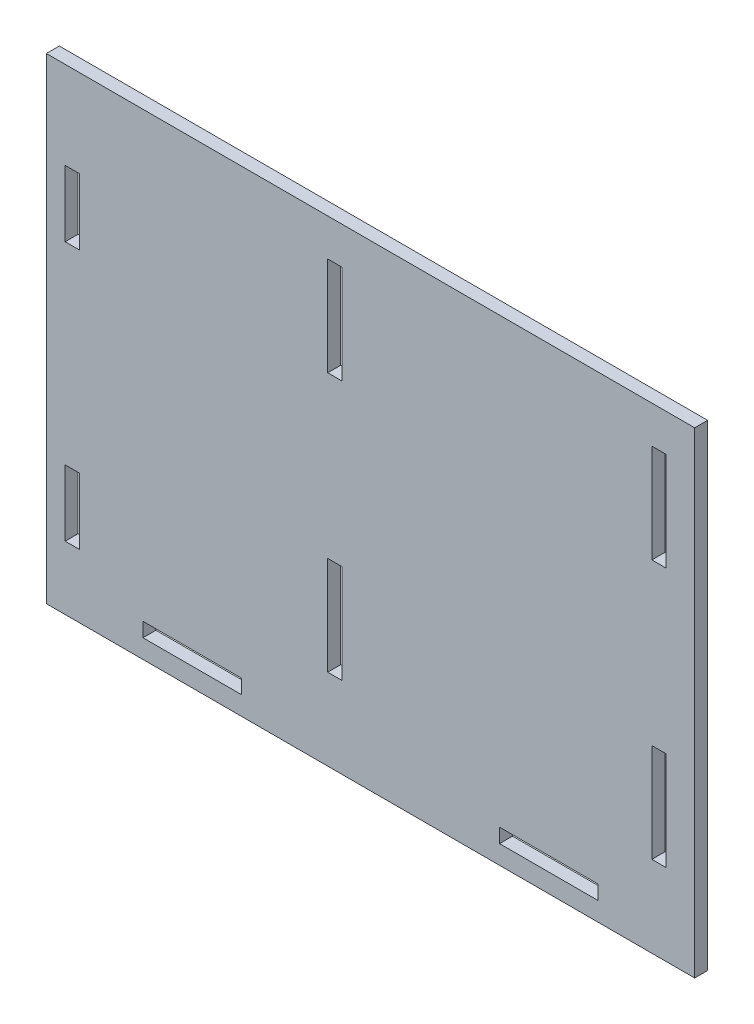
ISO-10303-21;
HEADER;
FILE_DESCRIPTION(('STEP AP214'),'2;1');
FILE_NAME('part.step','',(''),(''),'','','');
FILE_SCHEMA(('AUTOMOTIVE_DESIGN { 1 0 10303 214 1 1 1 1 }'));
ENDSEC;
DATA;
#1=APPLICATION_CONTEXT('core data for automotive mechanical design processes');
#2=APPLICATION_PROTOCOL_DEFINITION('international standard','automotive_design',2000,#1);
#3=PRODUCT_CONTEXT('',#1,'mechanical');
#4=PRODUCT('Part','Part','',(#3));
#5=PRODUCT_RELATED_PRODUCT_CATEGORY('part','',(#4));
#6=PRODUCT_DEFINITION_FORMATION('','',#4);
#7=PRODUCT_DEFINITION_CONTEXT('part definition',#1,'design');
#8=PRODUCT_DEFINITION('design','',#6,#7);
#9=PRODUCT_DEFINITION_SHAPE('','',#8);
#10=(LENGTH_UNIT() NAMED_UNIT(*) SI_UNIT(.MILLI.,.METRE.));
#11=(NAMED_UNIT(*) PLANE_ANGLE_UNIT() SI_UNIT($,.RADIAN.));
#12=(NAMED_UNIT(*) SI_UNIT($,.STERADIAN.) SOLID_ANGLE_UNIT());
#13=UNCERTAINTY_MEASURE_WITH_UNIT(LENGTH_MEASURE(1.E-05),#10,'distance_accuracy_value','');
#14=(GEOMETRIC_REPRESENTATION_CONTEXT(3) GLOBAL_UNCERTAINTY_ASSIGNED_CONTEXT((#13)) GLOBAL_UNIT_ASSIGNED_CONTEXT((#10,
#11,#12)) REPRESENTATION_CONTEXT('',''));
#15=CARTESIAN_POINT('',(0.,0.,0.));
#16=DIRECTION('',(0.,0.,1.));
#17=DIRECTION('',(1.,0.,0.));
#18=AXIS2_PLACEMENT_3D('',#15,#16,#17);
#19=CARTESIAN_POINT('',(0.,0.,4.));
#20=DIRECTION('',(0.,0.,1.));
#21=DIRECTION('',(1.,0.,0.));
#22=AXIS2_PLACEMENT_3D('',#19,#20,#21);
#23=PLANE('',#22);
#24=DIRECTION('',(1.,0.,0.));
#25=VECTOR('',#24,1.);
#26=CARTESIAN_POINT('',(0.,0.,4.));
#27=LINE('',#26,#25);
#28=CARTESIAN_POINT('',(0.,0.,4.));
#29=VERTEX_POINT('',#28);
#30=CARTESIAN_POINT('',(200.,0.,4.));
#31=VERTEX_POINT('',#30);
#32=EDGE_CURVE('E521',#29,#31,#27,.T.);
#33=ORIENTED_EDGE('',*,*,#32,.T.);
#34=DIRECTION('',(0.,1.,0.));
#35=VECTOR('',#34,1.);
#36=CARTESIAN_POINT('',(200.,0.,4.));
#37=LINE('',#36,#35);
#38=CARTESIAN_POINT('',(200.,147.,4.));
#39=VERTEX_POINT('',#38);
#40=EDGE_CURVE('E524',#31,#39,#37,.T.);
#41=ORIENTED_EDGE('',*,*,#40,.T.);
#42=DIRECTION('',(-1.,0.,0.));
#43=VECTOR('',#42,1.);
#44=CARTESIAN_POINT('',(200.,147.,4.));
#45=LINE('',#44,#43);
#46=CARTESIAN_POINT('',(0.,147.,4.));
#47=VERTEX_POINT('',#46);
#48=EDGE_CURVE('E527',#39,#47,#45,.T.);
#49=ORIENTED_EDGE('',*,*,#48,.T.);
#50=DIRECTION('',(0.,-1.,0.));
#51=VECTOR('',#50,1.);
#52=CARTESIAN_POINT('',(0.,0.,4.));
#53=LINE('',#52,#51);
#54=EDGE_CURVE('E529',#47,#29,#53,.T.);
#55=ORIENTED_EDGE('',*,*,#54,.T.);
#56=EDGE_LOOP('',(#33,#41,#49,#55));
#57=FACE_BOUND('',#56,.T.);
#58=DIRECTION('',(1.,0.,0.));
#59=VECTOR('',#58,1.);
#60=CARTESIAN_POINT('',(186.8,25.1,4.));
#61=LINE('',#60,#59);
#62=CARTESIAN_POINT('',(186.8,25.1,4.));
#63=VERTEX_POINT('',#62);
#64=CARTESIAN_POINT('',(191.2,25.1,4.));
#65=VERTEX_POINT('',#64);
#66=EDGE_CURVE('E492',#63,#65,#61,.T.);
#67=ORIENTED_EDGE('',*,*,#66,.F.);
#68=DIRECTION('',(0.,-1.,0.));
#69=VECTOR('',#68,1.);
#70=CARTESIAN_POINT('',(186.8,25.1,4.));
#71=LINE('',#70,#69);
#72=CARTESIAN_POINT('',(186.8,55.5,4.));
#73=VERTEX_POINT('',#72);
#74=EDGE_CURVE('E490',#73,#63,#71,.T.);
#75=ORIENTED_EDGE('',*,*,#74,.F.);
#76=DIRECTION('',(-1.,0.,0.));
#77=VECTOR('',#76,1.);
#78=CARTESIAN_POINT('',(186.8,55.5,4.));
#79=LINE('',#78,#77);
#80=CARTESIAN_POINT('',(191.2,55.5,4.));
#81=VERTEX_POINT('',#80);
#82=EDGE_CURVE('E498',#81,#73,#79,.T.);
#83=ORIENTED_EDGE('',*,*,#82,.F.);
#84=DIRECTION('',(0.,1.,0.));
#85=VECTOR('',#84,1.);
#86=CARTESIAN_POINT('',(191.2,25.1,4.));
#87=LINE('',#86,#85);
#88=EDGE_CURVE('E495',#65,#81,#87,.T.);
#89=ORIENTED_EDGE('',*,*,#88,.F.);
#90=EDGE_LOOP('',(#67,#75,#83,#89));
#91=FACE_BOUND('',#90,.T.);
#92=DIRECTION('',(1.,0.,0.));
#93=VECTOR('',#92,1.);
#94=CARTESIAN_POINT('',(139.8,5.8,4.));
#95=LINE('',#94,#93);
#96=CARTESIAN_POINT('',(139.8,5.8,4.));
#97=VERTEX_POINT('',#96);
#98=CARTESIAN_POINT('',(170.2,5.8,4.));
#99=VERTEX_POINT('',#98);
#100=EDGE_CURVE('E461',#97,#99,#95,.T.);
#101=ORIENTED_EDGE('',*,*,#100,.F.);
#102=DIRECTION('',(0.,-1.,0.));
#103=VECTOR('',#102,1.);
#104=CARTESIAN_POINT('',(139.8,10.2,4.));
#105=LINE('',#104,#103);
#106=CARTESIAN_POINT('',(139.8,10.2,4.));
#107=VERTEX_POINT('',#106);
#108=EDGE_CURVE('E459',#107,#97,#105,.T.);
#109=ORIENTED_EDGE('',*,*,#108,.F.);
#110=DIRECTION('',(-1.,0.,0.));
#111=VECTOR('',#110,1.);
#112=CARTESIAN_POINT('',(139.8,10.2,4.));
#113=LINE('',#112,#111);
#114=CARTESIAN_POINT('',(170.2,10.2,4.));
#115=VERTEX_POINT('',#114);
#116=EDGE_CURVE('E467',#115,#107,#113,.T.);
#117=ORIENTED_EDGE('',*,*,#116,.F.);
#118=DIRECTION('',(0.,1.,0.));
#119=VECTOR('',#118,1.);
#120=CARTESIAN_POINT('',(170.2,10.2,4.));
#121=LINE('',#120,#119);
#122=EDGE_CURVE('E464',#99,#115,#121,.T.);
#123=ORIENTED_EDGE('',*,*,#122,.F.);
#124=EDGE_LOOP('',(#101,#109,#117,#123));
#125=FACE_BOUND('',#124,.T.);
#126=DIRECTION('',(-1.,0.,0.));
#127=VECTOR('',#126,1.);
#128=CARTESIAN_POINT('',(10.2,40.,4.));
#129=LINE('',#128,#127);
#130=CARTESIAN_POINT('',(10.2,40.,4.));
#131=VERTEX_POINT('',#130);
#132=CARTESIAN_POINT('',(5.8,40.,4.));
#133=VERTEX_POINT('',#132);
#134=EDGE_CURVE('E430',#131,#133,#129,.T.);
#135=ORIENTED_EDGE('',*,*,#134,.F.);
#136=DIRECTION('',(0.,1.,0.));
#137=VECTOR('',#136,1.);
#138=CARTESIAN_POINT('',(10.2,40.,4.));
#139=LINE('',#138,#137);
#140=CARTESIAN_POINT('',(10.2,19.6,4.));
#141=VERTEX_POINT('',#140);
#142=EDGE_CURVE('E428',#141,#131,#139,.T.);
#143=ORIENTED_EDGE('',*,*,#142,.F.);
#144=DIRECTION('',(1.,0.,0.));
#145=VECTOR('',#144,1.);
#146=CARTESIAN_POINT('',(10.2,19.6,4.));
#147=LINE('',#146,#145);
#148=CARTESIAN_POINT('',(5.8,19.6,4.));
#149=VERTEX_POINT('',#148);
#150=EDGE_CURVE('E436',#149,#141,#147,.T.);
#151=ORIENTED_EDGE('',*,*,#150,.F.);
#152=DIRECTION('',(0.,-1.,0.));
#153=VECTOR('',#152,1.);
#154=CARTESIAN_POINT('',(5.8,40.,4.));
#155=LINE('',#154,#153);
#156=EDGE_CURVE('E433',#133,#149,#155,.T.);
#157=ORIENTED_EDGE('',*,*,#156,.F.);
#158=EDGE_LOOP('',(#135,#143,#151,#157));
#159=FACE_BOUND('',#158,.T.);
#160=DIRECTION('',(-1.,0.,0.));
#161=VECTOR('',#160,1.);
#162=CARTESIAN_POINT('',(60.2,10.2,4.));
#163=LINE('',#162,#161);
#164=CARTESIAN_POINT('',(60.2,10.2,4.));
#165=VERTEX_POINT('',#164);
#166=CARTESIAN_POINT('',(29.8,10.2,4.));
#167=VERTEX_POINT('',#166);
#168=EDGE_CURVE('E399',#165,#167,#163,.T.);
#169=ORIENTED_EDGE('',*,*,#168,.F.);
#170=DIRECTION('',(0.,1.,0.));
#171=VECTOR('',#170,1.);
#172=CARTESIAN_POINT('',(60.2,10.2,4.));
#173=LINE('',#172,#171);
#174=CARTESIAN_POINT('',(60.2,5.8,4.));
#175=VERTEX_POINT('',#174);
#176=EDGE_CURVE('E397',#175,#165,#173,.T.);
#177=ORIENTED_EDGE('',*,*,#176,.F.);
#178=DIRECTION('',(1.,0.,0.));
#179=VECTOR('',#178,1.);
#180=CARTESIAN_POINT('',(60.2,5.8,4.));
#181=LINE('',#180,#179);
#182=CARTESIAN_POINT('',(29.8,5.8,4.));
#183=VERTEX_POINT('',#182);
#184=EDGE_CURVE('E405',#183,#175,#181,.T.);
#185=ORIENTED_EDGE('',*,*,#184,.F.);
#186=DIRECTION('',(0.,-1.,0.));
#187=VECTOR('',#186,1.);
#188=CARTESIAN_POINT('',(29.8,10.2,4.));
#189=LINE('',#188,#187);
#190=EDGE_CURVE('E402',#167,#183,#189,.T.);
#191=ORIENTED_EDGE('',*,*,#190,.F.);
#192=EDGE_LOOP('',(#169,#177,#185,#191));
#193=FACE_BOUND('',#192,.T.);
#194=DIRECTION('',(1.,0.,0.));
#195=VECTOR('',#194,1.);
#196=CARTESIAN_POINT('',(5.8,99.6,4.));
#197=LINE('',#196,#195);
#198=CARTESIAN_POINT('',(5.8,99.6,4.));
#199=VERTEX_POINT('',#198);
#200=CARTESIAN_POINT('',(10.2,99.6,4.));
#201=VERTEX_POINT('',#200);
#202=EDGE_CURVE('E368',#199,#201,#197,.T.);
#203=ORIENTED_EDGE('',*,*,#202,.F.);
#204=DIRECTION('',(0.,-1.,0.));
#205=VECTOR('',#204,1.);
#206=CARTESIAN_POINT('',(5.8,99.6,4.));
#207=LINE('',#206,#205);
#208=CARTESIAN_POINT('',(5.8,120.,4.));
#209=VERTEX_POINT('',#208);
#210=EDGE_CURVE('E366',#209,#199,#207,.T.);
#211=ORIENTED_EDGE('',*,*,#210,.F.);
#212=DIRECTION('',(-1.,0.,0.));
#213=VECTOR('',#212,1.);
#214=CARTESIAN_POINT('',(5.8,120.,4.));
#215=LINE('',#214,#213);
#216=CARTESIAN_POINT('',(10.2,120.,4.));
#217=VERTEX_POINT('',#216);
#218=EDGE_CURVE('E374',#217,#209,#215,.T.);
#219=ORIENTED_EDGE('',*,*,#218,.F.);
#220=DIRECTION('',(0.,1.,0.));
#221=VECTOR('',#220,1.);
#222=CARTESIAN_POINT('',(10.2,99.6,4.));
#223=LINE('',#222,#221);
#224=EDGE_CURVE('E371',#201,#217,#223,.T.);
#225=ORIENTED_EDGE('',*,*,#224,.F.);
#226=EDGE_LOOP('',(#203,#211,#219,#225));
#227=FACE_BOUND('',#226,.T.);
#228=DIRECTION('',(1.,0.,0.));
#229=VECTOR('',#228,1.);
#230=CARTESIAN_POINT('',(186.8,105.1,4.));
#231=LINE('',#230,#229);
#232=CARTESIAN_POINT('',(186.8,105.1,4.));
#233=VERTEX_POINT('',#232);
#234=CARTESIAN_POINT('',(191.2,105.1,4.));
#235=VERTEX_POINT('',#234);
#236=EDGE_CURVE('E337',#233,#235,#231,.T.);
#237=ORIENTED_EDGE('',*,*,#236,.F.);
#238=DIRECTION('',(0.,-1.,0.));
#239=VECTOR('',#238,1.);
#240=CARTESIAN_POINT('',(186.8,135.5,4.));
#241=LINE('',#240,#239);
#242=CARTESIAN_POINT('',(186.8,135.5,4.));
#243=VERTEX_POINT('',#242);
#244=EDGE_CURVE('E335',#243,#233,#241,.T.);
#245=ORIENTED_EDGE('',*,*,#244,.F.);
#246=DIRECTION('',(-1.,0.,0.));
#247=VECTOR('',#246,1.);
#248=CARTESIAN_POINT('',(186.8,135.5,4.));
#249=LINE('',#248,#247);
#250=CARTESIAN_POINT('',(191.2,135.5,4.));
#251=VERTEX_POINT('',#250);
#252=EDGE_CURVE('E343',#251,#243,#249,.T.);
#253=ORIENTED_EDGE('',*,*,#252,.F.);
#254=DIRECTION('',(0.,1.,0.));
#255=VECTOR('',#254,1.);
#256=CARTESIAN_POINT('',(191.2,135.5,4.));
#257=LINE('',#256,#255);
#258=EDGE_CURVE('E340',#235,#251,#257,.T.);
#259=ORIENTED_EDGE('',*,*,#258,.F.);
#260=EDGE_LOOP('',(#237,#245,#253,#259));
#261=FACE_BOUND('',#260,.T.);
#262=DIRECTION('',(0.,1.,0.));
#263=VECTOR('',#262,1.);
#264=CARTESIAN_POINT('',(91.2,25.0999999999993,4.));
#265=LINE('',#264,#263);
#266=CARTESIAN_POINT('',(91.2,25.0999999999993,4.));
#267=VERTEX_POINT('',#266);
#268=CARTESIAN_POINT('',(91.2,55.4999999999993,4.));
#269=VERTEX_POINT('',#268);
#270=EDGE_CURVE('E306',#267,#269,#265,.T.);
#271=ORIENTED_EDGE('',*,*,#270,.F.);
#272=DIRECTION('',(1.,0.,0.));
#273=VECTOR('',#272,1.);
#274=CARTESIAN_POINT('',(86.8,25.0999999999993,4.));
#275=LINE('',#274,#273);
#276=CARTESIAN_POINT('',(86.8,25.0999999999993,4.));
#277=VERTEX_POINT('',#276);
#278=EDGE_CURVE('E304',#277,#267,#275,.T.);
#279=ORIENTED_EDGE('',*,*,#278,.F.);
#280=DIRECTION('',(0.,-1.,0.));
#281=VECTOR('',#280,1.);
#282=CARTESIAN_POINT('',(86.8,25.0999999999993,4.));
#283=LINE('',#282,#281);
#284=CARTESIAN_POINT('',(86.8,55.4999999999993,4.));
#285=VERTEX_POINT('',#284);
#286=EDGE_CURVE('E312',#285,#277,#283,.T.);
#287=ORIENTED_EDGE('',*,*,#286,.F.);
#288=DIRECTION('',(-1.,0.,0.));
#289=VECTOR('',#288,1.);
#290=CARTESIAN_POINT('',(86.8,55.4999999999993,4.));
#291=LINE('',#290,#289);
#292=EDGE_CURVE('E309',#269,#285,#291,.T.);
#293=ORIENTED_EDGE('',*,*,#292,.F.);
#294=EDGE_LOOP('',(#271,#279,#287,#293));
#295=FACE_BOUND('',#294,.T.);
#296=DIRECTION('',(0.,-1.,0.));
#297=VECTOR('',#296,1.);
#298=CARTESIAN_POINT('',(86.8,135.499999999999,4.));
#299=LINE('',#298,#297);
#300=CARTESIAN_POINT('',(86.8,135.499999999999,4.));
#301=VERTEX_POINT('',#300);
#302=CARTESIAN_POINT('',(86.8,105.099999999999,4.));
#303=VERTEX_POINT('',#302);
#304=EDGE_CURVE('E276',#301,#303,#299,.T.);
#305=ORIENTED_EDGE('',*,*,#304,.F.);
#306=DIRECTION('',(-1.,0.,0.));
#307=VECTOR('',#306,1.);
#308=CARTESIAN_POINT('',(86.8,135.499999999999,4.));
#309=LINE('',#308,#307);
#310=CARTESIAN_POINT('',(91.2,135.499999999999,4.));
#311=VERTEX_POINT('',#310);
#312=EDGE_CURVE('E268',#311,#301,#309,.T.);
#313=ORIENTED_EDGE('',*,*,#312,.F.);
#314=DIRECTION('',(0.,1.,0.));
#315=VECTOR('',#314,1.);
#316=CARTESIAN_POINT('',(91.2,135.499999999999,4.));
#317=LINE('',#316,#315);
#318=CARTESIAN_POINT('',(91.2,105.099999999999,4.));
#319=VERTEX_POINT('',#318);
#320=EDGE_CURVE('E290',#319,#311,#317,.T.);
#321=ORIENTED_EDGE('',*,*,#320,.F.);
#322=DIRECTION('',(1.,0.,0.));
#323=VECTOR('',#322,1.);
#324=CARTESIAN_POINT('',(86.8,105.099999999999,4.));
#325=LINE('',#324,#323);
#326=EDGE_CURVE('E288',#303,#319,#325,.T.);
#327=ORIENTED_EDGE('',*,*,#326,.F.);
#328=EDGE_LOOP('',(#305,#313,#321,#327));
#329=FACE_BOUND('',#328,.T.);
#330=ADVANCED_FACE('F35',(#57,#91,#125,#159,#193,#227,#261,#295,#329),#23,.T.);
#331=CARTESIAN_POINT('',(0.,0.,0.));
#332=DIRECTION('',(0.,0.,1.));
#333=DIRECTION('',(1.,0.,0.));
#334=AXIS2_PLACEMENT_3D('',#331,#332,#333);
#335=PLANE('',#334);
#336=DIRECTION('',(1.,0.,0.));
#337=VECTOR('',#336,1.);
#338=CARTESIAN_POINT('',(86.8,25.0999999999993,0.));
#339=LINE('',#338,#337);
#340=CARTESIAN_POINT('',(86.8,25.0999999999993,0.));
#341=VERTEX_POINT('',#340);
#342=CARTESIAN_POINT('',(91.2,25.0999999999993,0.));
#343=VERTEX_POINT('',#342);
#344=EDGE_CURVE('E284',#341,#343,#339,.T.);
#345=ORIENTED_EDGE('',*,*,#344,.T.);
#346=DIRECTION('',(0.,1.,0.));
#347=VECTOR('',#346,1.);
#348=CARTESIAN_POINT('',(91.2,25.0999999999993,0.));
#349=LINE('',#348,#347);
#350=CARTESIAN_POINT('',(91.2,55.4999999999993,0.));
#351=VERTEX_POINT('',#350);
#352=EDGE_CURVE('E317',#343,#351,#349,.T.);
#353=ORIENTED_EDGE('',*,*,#352,.T.);
#354=DIRECTION('',(-1.,0.,0.));
#355=VECTOR('',#354,1.);
#356=CARTESIAN_POINT('',(86.8,55.4999999999993,0.));
#357=LINE('',#356,#355);
#358=CARTESIAN_POINT('',(86.8,55.4999999999993,0.));
#359=VERTEX_POINT('',#358);
#360=EDGE_CURVE('E320',#351,#359,#357,.T.);
#361=ORIENTED_EDGE('',*,*,#360,.T.);
#362=DIRECTION('',(0.,-1.,0.));
#363=VECTOR('',#362,1.);
#364=CARTESIAN_POINT('',(86.8,25.0999999999993,0.));
#365=LINE('',#364,#363);
#366=EDGE_CURVE('E307',#359,#341,#365,.T.);
#367=ORIENTED_EDGE('',*,*,#366,.T.);
#368=EDGE_LOOP('',(#345,#353,#361,#367));
#369=FACE_BOUND('',#368,.T.);
#370=DIRECTION('',(0.,-1.,0.));
#371=VECTOR('',#370,1.);
#372=CARTESIAN_POINT('',(5.8,99.6,0.));
#373=LINE('',#372,#371);
#374=CARTESIAN_POINT('',(5.8,120.,0.));
#375=VERTEX_POINT('',#374);
#376=CARTESIAN_POINT('',(5.8,99.6,0.));
#377=VERTEX_POINT('',#376);
#378=EDGE_CURVE('E365',#375,#377,#373,.T.);
#379=ORIENTED_EDGE('',*,*,#378,.T.);
#380=DIRECTION('',(1.,0.,0.));
#381=VECTOR('',#380,1.);
#382=CARTESIAN_POINT('',(5.8,99.6,0.));
#383=LINE('',#382,#381);
#384=CARTESIAN_POINT('',(10.2,99.6,0.));
#385=VERTEX_POINT('',#384);
#386=EDGE_CURVE('E379',#377,#385,#383,.T.);
#387=ORIENTED_EDGE('',*,*,#386,.T.);
#388=DIRECTION('',(0.,1.,0.));
#389=VECTOR('',#388,1.);
#390=CARTESIAN_POINT('',(10.2,99.6,0.));
#391=LINE('',#390,#389);
#392=CARTESIAN_POINT('',(10.2,120.,0.));
#393=VERTEX_POINT('',#392);
#394=EDGE_CURVE('E382',#385,#393,#391,.T.);
#395=ORIENTED_EDGE('',*,*,#394,.T.);
#396=DIRECTION('',(-1.,0.,0.));
#397=VECTOR('',#396,1.);
#398=CARTESIAN_POINT('',(5.8,120.,0.));
#399=LINE('',#398,#397);
#400=EDGE_CURVE('E369',#393,#375,#399,.T.);
#401=ORIENTED_EDGE('',*,*,#400,.T.);
#402=EDGE_LOOP('',(#379,#387,#395,#401));
#403=FACE_BOUND('',#402,.T.);
#404=DIRECTION('',(0.,1.,0.));
#405=VECTOR('',#404,1.);
#406=CARTESIAN_POINT('',(10.2,40.,0.));
#407=LINE('',#406,#405);
#408=CARTESIAN_POINT('',(10.2,19.6,0.));
#409=VERTEX_POINT('',#408);
#410=CARTESIAN_POINT('',(10.2,40.,0.));
#411=VERTEX_POINT('',#410);
#412=EDGE_CURVE('E427',#409,#411,#407,.T.);
#413=ORIENTED_EDGE('',*,*,#412,.T.);
#414=DIRECTION('',(-1.,0.,0.));
#415=VECTOR('',#414,1.);
#416=CARTESIAN_POINT('',(10.2,40.,0.));
#417=LINE('',#416,#415);
#418=CARTESIAN_POINT('',(5.8,40.,0.));
#419=VERTEX_POINT('',#418);
#420=EDGE_CURVE('E441',#411,#419,#417,.T.);
#421=ORIENTED_EDGE('',*,*,#420,.T.);
#422=DIRECTION('',(0.,-1.,0.));
#423=VECTOR('',#422,1.);
#424=CARTESIAN_POINT('',(5.8,40.,0.));
#425=LINE('',#424,#423);
#426=CARTESIAN_POINT('',(5.8,19.6,0.));
#427=VERTEX_POINT('',#426);
#428=EDGE_CURVE('E444',#419,#427,#425,.T.);
#429=ORIENTED_EDGE('',*,*,#428,.T.);
#430=DIRECTION('',(1.,0.,0.));
#431=VECTOR('',#430,1.);
#432=CARTESIAN_POINT('',(10.2,19.6,0.));
#433=LINE('',#432,#431);
#434=EDGE_CURVE('E431',#427,#409,#433,.T.);
#435=ORIENTED_EDGE('',*,*,#434,.T.);
#436=EDGE_LOOP('',(#413,#421,#429,#435));
#437=FACE_BOUND('',#436,.T.);
#438=DIRECTION('',(0.,-1.,0.));
#439=VECTOR('',#438,1.);
#440=CARTESIAN_POINT('',(186.8,25.1,0.));
#441=LINE('',#440,#439);
#442=CARTESIAN_POINT('',(186.8,55.5,0.));
#443=VERTEX_POINT('',#442);
#444=CARTESIAN_POINT('',(186.8,25.1,0.));
#445=VERTEX_POINT('',#444);
#446=EDGE_CURVE('E489',#443,#445,#441,.T.);
#447=ORIENTED_EDGE('',*,*,#446,.T.);
#448=DIRECTION('',(1.,0.,0.));
#449=VECTOR('',#448,1.);
#450=CARTESIAN_POINT('',(186.8,25.1,0.));
#451=LINE('',#450,#449);
#452=CARTESIAN_POINT('',(191.2,25.1,0.));
#453=VERTEX_POINT('',#452);
#454=EDGE_CURVE('E503',#445,#453,#451,.T.);
#455=ORIENTED_EDGE('',*,*,#454,.T.);
#456=DIRECTION('',(0.,1.,0.));
#457=VECTOR('',#456,1.);
#458=CARTESIAN_POINT('',(191.2,25.1,0.));
#459=LINE('',#458,#457);
#460=CARTESIAN_POINT('',(191.2,55.5,0.));
#461=VERTEX_POINT('',#460);
#462=EDGE_CURVE('E506',#453,#461,#459,.T.);
#463=ORIENTED_EDGE('',*,*,#462,.T.);
#464=DIRECTION('',(-1.,0.,0.));
#465=VECTOR('',#464,1.);
#466=CARTESIAN_POINT('',(186.8,55.5,0.));
#467=LINE('',#466,#465);
#468=EDGE_CURVE('E493',#461,#443,#467,.T.);
#469=ORIENTED_EDGE('',*,*,#468,.T.);
#470=EDGE_LOOP('',(#447,#455,#463,#469));
#471=FACE_BOUND('',#470,.T.);
#472=DIRECTION('',(1.,0.,0.));
#473=VECTOR('',#472,1.);
#474=CARTESIAN_POINT('',(0.,0.,0.));
#475=LINE('',#474,#473);
#476=CARTESIAN_POINT('',(0.,0.,0.));
#477=VERTEX_POINT('',#476);
#478=CARTESIAN_POINT('',(200.,0.,0.));
#479=VERTEX_POINT('',#478);
#480=EDGE_CURVE('E520',#477,#479,#475,.T.);
#481=ORIENTED_EDGE('',*,*,#480,.F.);
#482=DIRECTION('',(0.,-1.,0.));
#483=VECTOR('',#482,1.);
#484=CARTESIAN_POINT('',(0.,0.,0.));
#485=LINE('',#484,#483);
#486=CARTESIAN_POINT('',(0.,147.,0.));
#487=VERTEX_POINT('',#486);
#488=EDGE_CURVE('E525',#487,#477,#485,.T.);
#489=ORIENTED_EDGE('',*,*,#488,.F.);
#490=DIRECTION('',(-1.,0.,0.));
#491=VECTOR('',#490,1.);
#492=CARTESIAN_POINT('',(200.,147.,0.));
#493=LINE('',#492,#491);
#494=CARTESIAN_POINT('',(200.,147.,0.));
#495=VERTEX_POINT('',#494);
#496=EDGE_CURVE('E536',#495,#487,#493,.T.);
#497=ORIENTED_EDGE('',*,*,#496,.F.);
#498=DIRECTION('',(0.,1.,0.));
#499=VECTOR('',#498,1.);
#500=CARTESIAN_POINT('',(200.,0.,0.));
#501=LINE('',#500,#499);
#502=EDGE_CURVE('E534',#479,#495,#501,.T.);
#503=ORIENTED_EDGE('',*,*,#502,.F.);
#504=EDGE_LOOP('',(#481,#489,#497,#503));
#505=FACE_BOUND('',#504,.T.);
#506=DIRECTION('',(0.,-1.,0.));
#507=VECTOR('',#506,1.);
#508=CARTESIAN_POINT('',(139.8,10.2,0.));
#509=LINE('',#508,#507);
#510=CARTESIAN_POINT('',(139.8,10.2,0.));
#511=VERTEX_POINT('',#510);
#512=CARTESIAN_POINT('',(139.8,5.8,0.));
#513=VERTEX_POINT('',#512);
#514=EDGE_CURVE('E458',#511,#513,#509,.T.);
#515=ORIENTED_EDGE('',*,*,#514,.T.);
#516=DIRECTION('',(1.,0.,0.));
#517=VECTOR('',#516,1.);
#518=CARTESIAN_POINT('',(139.8,5.8,0.));
#519=LINE('',#518,#517);
#520=CARTESIAN_POINT('',(170.2,5.8,0.));
#521=VERTEX_POINT('',#520);
#522=EDGE_CURVE('E472',#513,#521,#519,.T.);
#523=ORIENTED_EDGE('',*,*,#522,.T.);
#524=DIRECTION('',(0.,1.,0.));
#525=VECTOR('',#524,1.);
#526=CARTESIAN_POINT('',(170.2,10.2,0.));
#527=LINE('',#526,#525);
#528=CARTESIAN_POINT('',(170.2,10.2,0.));
#529=VERTEX_POINT('',#528);
#530=EDGE_CURVE('E475',#521,#529,#527,.T.);
#531=ORIENTED_EDGE('',*,*,#530,.T.);
#532=DIRECTION('',(-1.,0.,0.));
#533=VECTOR('',#532,1.);
#534=CARTESIAN_POINT('',(139.8,10.2,0.));
#535=LINE('',#534,#533);
#536=EDGE_CURVE('E462',#529,#511,#535,.T.);
#537=ORIENTED_EDGE('',*,*,#536,.T.);
#538=EDGE_LOOP('',(#515,#523,#531,#537));
#539=FACE_BOUND('',#538,.T.);
#540=DIRECTION('',(0.,1.,0.));
#541=VECTOR('',#540,1.);
#542=CARTESIAN_POINT('',(60.2,10.2,0.));
#543=LINE('',#542,#541);
#544=CARTESIAN_POINT('',(60.2,5.8,0.));
#545=VERTEX_POINT('',#544);
#546=CARTESIAN_POINT('',(60.2,10.2,0.));
#547=VERTEX_POINT('',#546);
#548=EDGE_CURVE('E396',#545,#547,#543,.T.);
#549=ORIENTED_EDGE('',*,*,#548,.T.);
#550=DIRECTION('',(-1.,0.,0.));
#551=VECTOR('',#550,1.);
#552=CARTESIAN_POINT('',(60.2,10.2,0.));
#553=LINE('',#552,#551);
#554=CARTESIAN_POINT('',(29.8,10.2,0.));
#555=VERTEX_POINT('',#554);
#556=EDGE_CURVE('E410',#547,#555,#553,.T.);
#557=ORIENTED_EDGE('',*,*,#556,.T.);
#558=DIRECTION('',(0.,-1.,0.));
#559=VECTOR('',#558,1.);
#560=CARTESIAN_POINT('',(29.8,10.2,0.));
#561=LINE('',#560,#559);
#562=CARTESIAN_POINT('',(29.8,5.8,0.));
#563=VERTEX_POINT('',#562);
#564=EDGE_CURVE('E413',#555,#563,#561,.T.);
#565=ORIENTED_EDGE('',*,*,#564,.T.);
#566=DIRECTION('',(1.,0.,0.));
#567=VECTOR('',#566,1.);
#568=CARTESIAN_POINT('',(60.2,5.8,0.));
#569=LINE('',#568,#567);
#570=EDGE_CURVE('E400',#563,#545,#569,.T.);
#571=ORIENTED_EDGE('',*,*,#570,.T.);
#572=EDGE_LOOP('',(#549,#557,#565,#571));
#573=FACE_BOUND('',#572,.T.);
#574=DIRECTION('',(0.,-1.,0.));
#575=VECTOR('',#574,1.);
#576=CARTESIAN_POINT('',(186.8,135.5,0.));
#577=LINE('',#576,#575);
#578=CARTESIAN_POINT('',(186.8,135.5,0.));
#579=VERTEX_POINT('',#578);
#580=CARTESIAN_POINT('',(186.8,105.1,0.));
#581=VERTEX_POINT('',#580);
#582=EDGE_CURVE('E334',#579,#581,#577,.T.);
#583=ORIENTED_EDGE('',*,*,#582,.T.);
#584=DIRECTION('',(1.,0.,0.));
#585=VECTOR('',#584,1.);
#586=CARTESIAN_POINT('',(186.8,105.1,0.));
#587=LINE('',#586,#585);
#588=CARTESIAN_POINT('',(191.2,105.1,0.));
#589=VERTEX_POINT('',#588);
#590=EDGE_CURVE('E348',#581,#589,#587,.T.);
#591=ORIENTED_EDGE('',*,*,#590,.T.);
#592=DIRECTION('',(0.,1.,0.));
#593=VECTOR('',#592,1.);
#594=CARTESIAN_POINT('',(191.2,135.5,0.));
#595=LINE('',#594,#593);
#596=CARTESIAN_POINT('',(191.2,135.5,0.));
#597=VERTEX_POINT('',#596);
#598=EDGE_CURVE('E351',#589,#597,#595,.T.);
#599=ORIENTED_EDGE('',*,*,#598,.T.);
#600=DIRECTION('',(-1.,0.,0.));
#601=VECTOR('',#600,1.);
#602=CARTESIAN_POINT('',(186.8,135.5,0.));
#603=LINE('',#602,#601);
#604=EDGE_CURVE('E338',#597,#579,#603,.T.);
#605=ORIENTED_EDGE('',*,*,#604,.T.);
#606=EDGE_LOOP('',(#583,#591,#599,#605));
#607=FACE_BOUND('',#606,.T.);
#608=DIRECTION('',(-1.,0.,0.));
#609=VECTOR('',#608,1.);
#610=CARTESIAN_POINT('',(86.8,135.499999999999,0.));
#611=LINE('',#610,#609);
#612=CARTESIAN_POINT('',(91.2,135.499999999999,0.));
#613=VERTEX_POINT('',#612);
#614=CARTESIAN_POINT('',(86.8,135.499999999999,0.));
#615=VERTEX_POINT('',#614);
#616=EDGE_CURVE('E58',#613,#615,#611,.T.);
#617=ORIENTED_EDGE('',*,*,#616,.T.);
#618=DIRECTION('',(0.,-1.,0.));
#619=VECTOR('',#618,1.);
#620=CARTESIAN_POINT('',(86.8,135.499999999999,0.));
#621=LINE('',#620,#619);
#622=CARTESIAN_POINT('',(86.8,105.099999999999,0.));
#623=VERTEX_POINT('',#622);
#624=EDGE_CURVE('E283',#615,#623,#621,.T.);
#625=ORIENTED_EDGE('',*,*,#624,.T.);
#626=DIRECTION('',(1.,0.,0.));
#627=VECTOR('',#626,1.);
#628=CARTESIAN_POINT('',(86.8,105.099999999999,0.));
#629=LINE('',#628,#627);
#630=CARTESIAN_POINT('',(91.2,105.099999999999,0.));
#631=VERTEX_POINT('',#630);
#632=EDGE_CURVE('E296',#623,#631,#629,.T.);
#633=ORIENTED_EDGE('',*,*,#632,.T.);
#634=DIRECTION('',(0.,1.,0.));
#635=VECTOR('',#634,1.);
#636=CARTESIAN_POINT('',(91.2,135.499999999999,0.));
#637=LINE('',#636,#635);
#638=EDGE_CURVE('E277',#631,#613,#637,.T.);
#639=ORIENTED_EDGE('',*,*,#638,.T.);
#640=EDGE_LOOP('',(#617,#625,#633,#639));
#641=FACE_BOUND('',#640,.T.);
#642=ADVANCED_FACE('F554',(#369,#403,#437,#471,#505,#539,#573,#607,#641),#335,.F.);
#643=CARTESIAN_POINT('',(0.,0.,4.));
#644=DIRECTION('',(0.,1.,0.));
#645=DIRECTION('',(0.,0.,1.));
#646=AXIS2_PLACEMENT_3D('',#643,#644,#645);
#647=PLANE('',#646);
#648=ORIENTED_EDGE('',*,*,#480,.T.);
#649=DIRECTION('',(0.,0.,-1.));
#650=VECTOR('',#649,1.);
#651=CARTESIAN_POINT('',(200.,0.,4.));
#652=LINE('',#651,#650);
#653=EDGE_CURVE('E11',#31,#479,#652,.T.);
#654=ORIENTED_EDGE('',*,*,#653,.F.);
#655=ORIENTED_EDGE('',*,*,#32,.F.);
#656=DIRECTION('',(0.,0.,-1.));
#657=VECTOR('',#656,1.);
#658=CARTESIAN_POINT('',(0.,0.,4.));
#659=LINE('',#658,#657);
#660=EDGE_CURVE('E531',#29,#477,#659,.T.);
#661=ORIENTED_EDGE('',*,*,#660,.T.);
#662=EDGE_LOOP('',(#648,#654,#655,#661));
#663=FACE_BOUND('',#662,.T.);
#664=ADVANCED_FACE('F37',(#663),#647,.F.);
#665=CARTESIAN_POINT('',(200.,0.,4.));
#666=DIRECTION('',(-1.,0.,0.));
#667=DIRECTION('',(0.,0.,1.));
#668=AXIS2_PLACEMENT_3D('',#665,#666,#667);
#669=PLANE('',#668);
#670=ORIENTED_EDGE('',*,*,#502,.T.);
#671=DIRECTION('',(0.,0.,-1.));
#672=VECTOR('',#671,1.);
#673=CARTESIAN_POINT('',(200.,147.,4.));
#674=LINE('',#673,#672);
#675=EDGE_CURVE('E43',#39,#495,#674,.T.);
#676=ORIENTED_EDGE('',*,*,#675,.F.);
#677=ORIENTED_EDGE('',*,*,#40,.F.);
#678=ORIENTED_EDGE('',*,*,#653,.T.);
#679=EDGE_LOOP('',(#670,#676,#677,#678));
#680=FACE_BOUND('',#679,.T.);
#681=ADVANCED_FACE('F565',(#680),#669,.F.);
#682=CARTESIAN_POINT('',(200.,147.,4.));
#683=DIRECTION('',(0.,-1.,0.));
#684=DIRECTION('',(0.,0.,-1.));
#685=AXIS2_PLACEMENT_3D('',#682,#683,#684);
#686=PLANE('',#685);
#687=ORIENTED_EDGE('',*,*,#496,.T.);
#688=DIRECTION('',(0.,0.,-1.));
#689=VECTOR('',#688,1.);
#690=CARTESIAN_POINT('',(0.,147.,4.));
#691=LINE('',#690,#689);
#692=EDGE_CURVE('E541',#47,#487,#691,.T.);
#693=ORIENTED_EDGE('',*,*,#692,.F.);
#694=ORIENTED_EDGE('',*,*,#48,.F.);
#695=ORIENTED_EDGE('',*,*,#675,.T.);
#696=EDGE_LOOP('',(#687,#693,#694,#695));
#697=FACE_BOUND('',#696,.T.);
#698=ADVANCED_FACE('F548',(#697),#686,.F.);
#699=CARTESIAN_POINT('',(0.,0.,4.));
#700=DIRECTION('',(1.,0.,0.));
#701=DIRECTION('',(0.,0.,-1.));
#702=AXIS2_PLACEMENT_3D('',#699,#700,#701);
#703=PLANE('',#702);
#704=ORIENTED_EDGE('',*,*,#488,.T.);
#705=ORIENTED_EDGE('',*,*,#660,.F.);
#706=ORIENTED_EDGE('',*,*,#54,.F.);
#707=ORIENTED_EDGE('',*,*,#692,.T.);
#708=EDGE_LOOP('',(#704,#705,#706,#707));
#709=FACE_BOUND('',#708,.T.);
#710=ADVANCED_FACE('F558',(#709),#703,.F.);
#711=CARTESIAN_POINT('',(186.8,25.1,4.));
#712=DIRECTION('',(1.,0.,0.));
#713=DIRECTION('',(0.,0.,-1.));
#714=AXIS2_PLACEMENT_3D('',#711,#712,#713);
#715=PLANE('',#714);
#716=ORIENTED_EDGE('',*,*,#446,.F.);
#717=DIRECTION('',(0.,0.,-1.));
#718=VECTOR('',#717,1.);
#719=CARTESIAN_POINT('',(186.8,55.5,4.));
#720=LINE('',#719,#718);
#721=EDGE_CURVE('E500',#73,#443,#720,.T.);
#722=ORIENTED_EDGE('',*,*,#721,.F.);
#723=ORIENTED_EDGE('',*,*,#74,.T.);
#724=DIRECTION('',(0.,0.,-1.));
#725=VECTOR('',#724,1.);
#726=CARTESIAN_POINT('',(186.8,25.1,4.));
#727=LINE('',#726,#725);
#728=EDGE_CURVE('E517',#63,#445,#727,.T.);
#729=ORIENTED_EDGE('',*,*,#728,.T.);
#730=EDGE_LOOP('',(#716,#722,#723,#729));
#731=FACE_BOUND('',#730,.T.);
#732=ADVANCED_FACE('F580',(#731),#715,.T.);
#733=CARTESIAN_POINT('',(186.8,25.1,4.));
#734=DIRECTION('',(0.,1.,0.));
#735=DIRECTION('',(0.,0.,1.));
#736=AXIS2_PLACEMENT_3D('',#733,#734,#735);
#737=PLANE('',#736);
#738=ORIENTED_EDGE('',*,*,#454,.F.);
#739=ORIENTED_EDGE('',*,*,#728,.F.);
#740=ORIENTED_EDGE('',*,*,#66,.T.);
#741=DIRECTION('',(0.,0.,-1.));
#742=VECTOR('',#741,1.);
#743=CARTESIAN_POINT('',(191.2,25.1,4.));
#744=LINE('',#743,#742);
#745=EDGE_CURVE('E515',#65,#453,#744,.T.);
#746=ORIENTED_EDGE('',*,*,#745,.T.);
#747=EDGE_LOOP('',(#738,#739,#740,#746));
#748=FACE_BOUND('',#747,.T.);
#749=ADVANCED_FACE('F587',(#748),#737,.T.);
#750=CARTESIAN_POINT('',(191.2,25.1,4.));
#751=DIRECTION('',(-1.,0.,0.));
#752=DIRECTION('',(0.,0.,1.));
#753=AXIS2_PLACEMENT_3D('',#750,#751,#752);
#754=PLANE('',#753);
#755=ORIENTED_EDGE('',*,*,#462,.F.);
#756=ORIENTED_EDGE('',*,*,#745,.F.);
#757=ORIENTED_EDGE('',*,*,#88,.T.);
#758=DIRECTION('',(0.,0.,-1.));
#759=VECTOR('',#758,1.);
#760=CARTESIAN_POINT('',(191.2,55.5,4.));
#761=LINE('',#760,#759);
#762=EDGE_CURVE('E513',#81,#461,#761,.T.);
#763=ORIENTED_EDGE('',*,*,#762,.T.);
#764=EDGE_LOOP('',(#755,#756,#757,#763));
#765=FACE_BOUND('',#764,.T.);
#766=ADVANCED_FACE('F592',(#765),#754,.T.);
#767=CARTESIAN_POINT('',(186.8,55.5,4.));
#768=DIRECTION('',(0.,-1.,0.));
#769=DIRECTION('',(0.,0.,-1.));
#770=AXIS2_PLACEMENT_3D('',#767,#768,#769);
#771=PLANE('',#770);
#772=ORIENTED_EDGE('',*,*,#468,.F.);
#773=ORIENTED_EDGE('',*,*,#762,.F.);
#774=ORIENTED_EDGE('',*,*,#82,.T.);
#775=ORIENTED_EDGE('',*,*,#721,.T.);
#776=EDGE_LOOP('',(#772,#773,#774,#775));
#777=FACE_BOUND('',#776,.T.);
#778=ADVANCED_FACE('F600',(#777),#771,.T.);
#779=CARTESIAN_POINT('',(139.8,10.2,4.));
#780=DIRECTION('',(1.,0.,0.));
#781=DIRECTION('',(0.,0.,-1.));
#782=AXIS2_PLACEMENT_3D('',#779,#780,#781);
#783=PLANE('',#782);
#784=ORIENTED_EDGE('',*,*,#514,.F.);
#785=DIRECTION('',(0.,0.,-1.));
#786=VECTOR('',#785,1.);
#787=CARTESIAN_POINT('',(139.8,10.2,4.));
#788=LINE('',#787,#786);
#789=EDGE_CURVE('E469',#107,#511,#788,.T.);
#790=ORIENTED_EDGE('',*,*,#789,.F.);
#791=ORIENTED_EDGE('',*,*,#108,.T.);
#792=DIRECTION('',(0.,0.,-1.));
#793=VECTOR('',#792,1.);
#794=CARTESIAN_POINT('',(139.8,5.8,4.));
#795=LINE('',#794,#793);
#796=EDGE_CURVE('E486',#97,#513,#795,.T.);
#797=ORIENTED_EDGE('',*,*,#796,.T.);
#798=EDGE_LOOP('',(#784,#790,#791,#797));
#799=FACE_BOUND('',#798,.T.);
#800=ADVANCED_FACE('F735',(#799),#783,.T.);
#801=CARTESIAN_POINT('',(139.8,5.8,4.));
#802=DIRECTION('',(0.,1.,0.));
#803=DIRECTION('',(-1.,0.,0.));
#804=AXIS2_PLACEMENT_3D('',#801,#802,#803);
#805=PLANE('',#804);
#806=ORIENTED_EDGE('',*,*,#522,.F.);
#807=ORIENTED_EDGE('',*,*,#796,.F.);
#808=ORIENTED_EDGE('',*,*,#100,.T.);
#809=DIRECTION('',(0.,0.,-1.));
#810=VECTOR('',#809,1.);
#811=CARTESIAN_POINT('',(170.2,5.8,4.));
#812=LINE('',#811,#810);
#813=EDGE_CURVE('E484',#99,#521,#812,.T.);
#814=ORIENTED_EDGE('',*,*,#813,.T.);
#815=EDGE_LOOP('',(#806,#807,#808,#814));
#816=FACE_BOUND('',#815,.T.);
#817=ADVANCED_FACE('F731',(#816),#805,.T.);
#818=CARTESIAN_POINT('',(170.2,10.2,4.));
#819=DIRECTION('',(-1.,0.,0.));
#820=DIRECTION('',(0.,0.,1.));
#821=AXIS2_PLACEMENT_3D('',#818,#819,#820);
#822=PLANE('',#821);
#823=ORIENTED_EDGE('',*,*,#530,.F.);
#824=ORIENTED_EDGE('',*,*,#813,.F.);
#825=ORIENTED_EDGE('',*,*,#122,.T.);
#826=DIRECTION('',(0.,0.,-1.));
#827=VECTOR('',#826,1.);
#828=CARTESIAN_POINT('',(170.2,10.2,4.));
#829=LINE('',#828,#827);
#830=EDGE_CURVE('E482',#115,#529,#829,.T.);
#831=ORIENTED_EDGE('',*,*,#830,.T.);
#832=EDGE_LOOP('',(#823,#824,#825,#831));
#833=FACE_BOUND('',#832,.T.);
#834=ADVANCED_FACE('F727',(#833),#822,.T.);
#835=CARTESIAN_POINT('',(139.8,10.2,4.));
#836=DIRECTION('',(0.,-1.,0.));
#837=DIRECTION('',(0.,0.,-1.));
#838=AXIS2_PLACEMENT_3D('',#835,#836,#837);
#839=PLANE('',#838);
#840=ORIENTED_EDGE('',*,*,#536,.F.);
#841=ORIENTED_EDGE('',*,*,#830,.F.);
#842=ORIENTED_EDGE('',*,*,#116,.T.);
#843=ORIENTED_EDGE('',*,*,#789,.T.);
#844=EDGE_LOOP('',(#840,#841,#842,#843));
#845=FACE_BOUND('',#844,.T.);
#846=ADVANCED_FACE('F723',(#845),#839,.T.);
#847=CARTESIAN_POINT('',(10.2,40.,4.));
#848=DIRECTION('',(-1.,0.,0.));
#849=DIRECTION('',(0.,0.,1.));
#850=AXIS2_PLACEMENT_3D('',#847,#848,#849);
#851=PLANE('',#850);
#852=ORIENTED_EDGE('',*,*,#412,.F.);
#853=DIRECTION('',(0.,0.,-1.));
#854=VECTOR('',#853,1.);
#855=CARTESIAN_POINT('',(10.2,19.6,4.));
#856=LINE('',#855,#854);
#857=EDGE_CURVE('E438',#141,#409,#856,.T.);
#858=ORIENTED_EDGE('',*,*,#857,.F.);
#859=ORIENTED_EDGE('',*,*,#142,.T.);
#860=DIRECTION('',(0.,0.,-1.));
#861=VECTOR('',#860,1.);
#862=CARTESIAN_POINT('',(10.2,40.,4.));
#863=LINE('',#862,#861);
#864=EDGE_CURVE('E455',#131,#411,#863,.T.);
#865=ORIENTED_EDGE('',*,*,#864,.T.);
#866=EDGE_LOOP('',(#852,#858,#859,#865));
#867=FACE_BOUND('',#866,.T.);
#868=ADVANCED_FACE('F719',(#867),#851,.T.);
#869=CARTESIAN_POINT('',(10.2,40.,4.));
#870=DIRECTION('',(0.,-1.,0.));
#871=DIRECTION('',(0.,0.,-1.));
#872=AXIS2_PLACEMENT_3D('',#869,#870,#871);
#873=PLANE('',#872);
#874=ORIENTED_EDGE('',*,*,#420,.F.);
#875=ORIENTED_EDGE('',*,*,#864,.F.);
#876=ORIENTED_EDGE('',*,*,#134,.T.);
#877=DIRECTION('',(0.,0.,-1.));
#878=VECTOR('',#877,1.);
#879=CARTESIAN_POINT('',(5.8,40.,4.));
#880=LINE('',#879,#878);
#881=EDGE_CURVE('E453',#133,#419,#880,.T.);
#882=ORIENTED_EDGE('',*,*,#881,.T.);
#883=EDGE_LOOP('',(#874,#875,#876,#882));
#884=FACE_BOUND('',#883,.T.);
#885=ADVANCED_FACE('F715',(#884),#873,.T.);
#886=CARTESIAN_POINT('',(5.8,40.,4.));
#887=DIRECTION('',(1.,0.,0.));
#888=DIRECTION('',(0.,0.,-1.));
#889=AXIS2_PLACEMENT_3D('',#886,#887,#888);
#890=PLANE('',#889);
#891=ORIENTED_EDGE('',*,*,#428,.F.);
#892=ORIENTED_EDGE('',*,*,#881,.F.);
#893=ORIENTED_EDGE('',*,*,#156,.T.);
#894=DIRECTION('',(0.,0.,-1.));
#895=VECTOR('',#894,1.);
#896=CARTESIAN_POINT('',(5.8,19.6,4.));
#897=LINE('',#896,#895);
#898=EDGE_CURVE('E451',#149,#427,#897,.T.);
#899=ORIENTED_EDGE('',*,*,#898,.T.);
#900=EDGE_LOOP('',(#891,#892,#893,#899));
#901=FACE_BOUND('',#900,.T.);
#902=ADVANCED_FACE('F711',(#901),#890,.T.);
#903=CARTESIAN_POINT('',(10.2,19.6,4.));
#904=DIRECTION('',(0.,1.,0.));
#905=DIRECTION('',(-1.,0.,0.));
#906=AXIS2_PLACEMENT_3D('',#903,#904,#905);
#907=PLANE('',#906);
#908=ORIENTED_EDGE('',*,*,#434,.F.);
#909=ORIENTED_EDGE('',*,*,#898,.F.);
#910=ORIENTED_EDGE('',*,*,#150,.T.);
#911=ORIENTED_EDGE('',*,*,#857,.T.);
#912=EDGE_LOOP('',(#908,#909,#910,#911));
#913=FACE_BOUND('',#912,.T.);
#914=ADVANCED_FACE('F707',(#913),#907,.T.);
#915=CARTESIAN_POINT('',(60.2,10.2,4.));
#916=DIRECTION('',(-1.,0.,0.));
#917=DIRECTION('',(0.,0.,1.));
#918=AXIS2_PLACEMENT_3D('',#915,#916,#917);
#919=PLANE('',#918);
#920=ORIENTED_EDGE('',*,*,#548,.F.);
#921=DIRECTION('',(0.,0.,-1.));
#922=VECTOR('',#921,1.);
#923=CARTESIAN_POINT('',(60.2,5.8,4.));
#924=LINE('',#923,#922);
#925=EDGE_CURVE('E407',#175,#545,#924,.T.);
#926=ORIENTED_EDGE('',*,*,#925,.F.);
#927=ORIENTED_EDGE('',*,*,#176,.T.);
#928=DIRECTION('',(0.,0.,-1.));
#929=VECTOR('',#928,1.);
#930=CARTESIAN_POINT('',(60.2,10.2,4.));
#931=LINE('',#930,#929);
#932=EDGE_CURVE('E424',#165,#547,#931,.T.);
#933=ORIENTED_EDGE('',*,*,#932,.T.);
#934=EDGE_LOOP('',(#920,#926,#927,#933));
#935=FACE_BOUND('',#934,.T.);
#936=ADVANCED_FACE('F703',(#935),#919,.T.);
#937=CARTESIAN_POINT('',(60.2,10.2,4.));
#938=DIRECTION('',(0.,-1.,0.));
#939=DIRECTION('',(0.,0.,-1.));
#940=AXIS2_PLACEMENT_3D('',#937,#938,#939);
#941=PLANE('',#940);
#942=ORIENTED_EDGE('',*,*,#556,.F.);
#943=ORIENTED_EDGE('',*,*,#932,.F.);
#944=ORIENTED_EDGE('',*,*,#168,.T.);
#945=DIRECTION('',(0.,0.,-1.));
#946=VECTOR('',#945,1.);
#947=CARTESIAN_POINT('',(29.8,10.2,4.));
#948=LINE('',#947,#946);
#949=EDGE_CURVE('E422',#167,#555,#948,.T.);
#950=ORIENTED_EDGE('',*,*,#949,.T.);
#951=EDGE_LOOP('',(#942,#943,#944,#950));
#952=FACE_BOUND('',#951,.T.);
#953=ADVANCED_FACE('F699',(#952),#941,.T.);
#954=CARTESIAN_POINT('',(29.8,10.2,4.));
#955=DIRECTION('',(1.,0.,0.));
#956=DIRECTION('',(0.,0.,-1.));
#957=AXIS2_PLACEMENT_3D('',#954,#955,#956);
#958=PLANE('',#957);
#959=ORIENTED_EDGE('',*,*,#564,.F.);
#960=ORIENTED_EDGE('',*,*,#949,.F.);
#961=ORIENTED_EDGE('',*,*,#190,.T.);
#962=DIRECTION('',(0.,0.,-1.));
#963=VECTOR('',#962,1.);
#964=CARTESIAN_POINT('',(29.8,5.8,4.));
#965=LINE('',#964,#963);
#966=EDGE_CURVE('E420',#183,#563,#965,.T.);
#967=ORIENTED_EDGE('',*,*,#966,.T.);
#968=EDGE_LOOP('',(#959,#960,#961,#967));
#969=FACE_BOUND('',#968,.T.);
#970=ADVANCED_FACE('F695',(#969),#958,.T.);
#971=CARTESIAN_POINT('',(60.2,5.8,4.));
#972=DIRECTION('',(0.,1.,0.));
#973=DIRECTION('',(-1.,0.,0.));
#974=AXIS2_PLACEMENT_3D('',#971,#972,#973);
#975=PLANE('',#974);
#976=ORIENTED_EDGE('',*,*,#570,.F.);
#977=ORIENTED_EDGE('',*,*,#966,.F.);
#978=ORIENTED_EDGE('',*,*,#184,.T.);
#979=ORIENTED_EDGE('',*,*,#925,.T.);
#980=EDGE_LOOP('',(#976,#977,#978,#979));
#981=FACE_BOUND('',#980,.T.);
#982=ADVANCED_FACE('F691',(#981),#975,.T.);
#983=CARTESIAN_POINT('',(5.8,99.6,4.));
#984=DIRECTION('',(1.,0.,0.));
#985=DIRECTION('',(0.,0.,-1.));
#986=AXIS2_PLACEMENT_3D('',#983,#984,#985);
#987=PLANE('',#986);
#988=ORIENTED_EDGE('',*,*,#378,.F.);
#989=DIRECTION('',(0.,0.,-1.));
#990=VECTOR('',#989,1.);
#991=CARTESIAN_POINT('',(5.8,120.,4.));
#992=LINE('',#991,#990);
#993=EDGE_CURVE('E376',#209,#375,#992,.T.);
#994=ORIENTED_EDGE('',*,*,#993,.F.);
#995=ORIENTED_EDGE('',*,*,#210,.T.);
#996=DIRECTION('',(0.,0.,-1.));
#997=VECTOR('',#996,1.);
#998=CARTESIAN_POINT('',(5.8,99.6,4.));
#999=LINE('',#998,#997);
#1000=EDGE_CURVE('E393',#199,#377,#999,.T.);
#1001=ORIENTED_EDGE('',*,*,#1000,.T.);
#1002=EDGE_LOOP('',(#988,#994,#995,#1001));
#1003=FACE_BOUND('',#1002,.T.);
#1004=ADVANCED_FACE('F687',(#1003),#987,.T.);
#1005=CARTESIAN_POINT('',(5.8,99.6,4.));
#1006=DIRECTION('',(0.,1.,0.));
#1007=DIRECTION('',(-1.,0.,0.));
#1008=AXIS2_PLACEMENT_3D('',#1005,#1006,#1007);
#1009=PLANE('',#1008);
#1010=ORIENTED_EDGE('',*,*,#386,.F.);
#1011=ORIENTED_EDGE('',*,*,#1000,.F.);
#1012=ORIENTED_EDGE('',*,*,#202,.T.);
#1013=DIRECTION('',(0.,0.,-1.));
#1014=VECTOR('',#1013,1.);
#1015=CARTESIAN_POINT('',(10.2,99.6,4.));
#1016=LINE('',#1015,#1014);
#1017=EDGE_CURVE('E391',#201,#385,#1016,.T.);
#1018=ORIENTED_EDGE('',*,*,#1017,.T.);
#1019=EDGE_LOOP('',(#1010,#1011,#1012,#1018));
#1020=FACE_BOUND('',#1019,.T.);
#1021=ADVANCED_FACE('F683',(#1020),#1009,.T.);
#1022=CARTESIAN_POINT('',(10.2,99.6,4.));
#1023=DIRECTION('',(-1.,0.,0.));
#1024=DIRECTION('',(0.,0.,1.));
#1025=AXIS2_PLACEMENT_3D('',#1022,#1023,#1024);
#1026=PLANE('',#1025);
#1027=ORIENTED_EDGE('',*,*,#394,.F.);
#1028=ORIENTED_EDGE('',*,*,#1017,.F.);
#1029=ORIENTED_EDGE('',*,*,#224,.T.);
#1030=DIRECTION('',(0.,0.,-1.));
#1031=VECTOR('',#1030,1.);
#1032=CARTESIAN_POINT('',(10.2,120.,4.));
#1033=LINE('',#1032,#1031);
#1034=EDGE_CURVE('E389',#217,#393,#1033,.T.);
#1035=ORIENTED_EDGE('',*,*,#1034,.T.);
#1036=EDGE_LOOP('',(#1027,#1028,#1029,#1035));
#1037=FACE_BOUND('',#1036,.T.);
#1038=ADVANCED_FACE('F679',(#1037),#1026,.T.);
#1039=CARTESIAN_POINT('',(5.8,120.,4.));
#1040=DIRECTION('',(0.,-1.,0.));
#1041=DIRECTION('',(1.,0.,0.));
#1042=AXIS2_PLACEMENT_3D('',#1039,#1040,#1041);
#1043=PLANE('',#1042);
#1044=ORIENTED_EDGE('',*,*,#400,.F.);
#1045=ORIENTED_EDGE('',*,*,#1034,.F.);
#1046=ORIENTED_EDGE('',*,*,#218,.T.);
#1047=ORIENTED_EDGE('',*,*,#993,.T.);
#1048=EDGE_LOOP('',(#1044,#1045,#1046,#1047));
#1049=FACE_BOUND('',#1048,.T.);
#1050=ADVANCED_FACE('F675',(#1049),#1043,.T.);
#1051=CARTESIAN_POINT('',(186.8,135.5,4.));
#1052=DIRECTION('',(1.,0.,0.));
#1053=DIRECTION('',(0.,0.,-1.));
#1054=AXIS2_PLACEMENT_3D('',#1051,#1052,#1053);
#1055=PLANE('',#1054);
#1056=ORIENTED_EDGE('',*,*,#582,.F.);
#1057=DIRECTION('',(0.,0.,-1.));
#1058=VECTOR('',#1057,1.);
#1059=CARTESIAN_POINT('',(186.8,135.5,4.));
#1060=LINE('',#1059,#1058);
#1061=EDGE_CURVE('E345',#243,#579,#1060,.T.);
#1062=ORIENTED_EDGE('',*,*,#1061,.F.);
#1063=ORIENTED_EDGE('',*,*,#244,.T.);
#1064=DIRECTION('',(0.,0.,-1.));
#1065=VECTOR('',#1064,1.);
#1066=CARTESIAN_POINT('',(186.8,105.1,4.));
#1067=LINE('',#1066,#1065);
#1068=EDGE_CURVE('E362',#233,#581,#1067,.T.);
#1069=ORIENTED_EDGE('',*,*,#1068,.T.);
#1070=EDGE_LOOP('',(#1056,#1062,#1063,#1069));
#1071=FACE_BOUND('',#1070,.T.);
#1072=ADVANCED_FACE('F671',(#1071),#1055,.T.);
#1073=CARTESIAN_POINT('',(186.8,105.1,4.));
#1074=DIRECTION('',(0.,1.,0.));
#1075=DIRECTION('',(0.,0.,1.));
#1076=AXIS2_PLACEMENT_3D('',#1073,#1074,#1075);
#1077=PLANE('',#1076);
#1078=ORIENTED_EDGE('',*,*,#590,.F.);
#1079=ORIENTED_EDGE('',*,*,#1068,.F.);
#1080=ORIENTED_EDGE('',*,*,#236,.T.);
#1081=DIRECTION('',(0.,0.,-1.));
#1082=VECTOR('',#1081,1.);
#1083=CARTESIAN_POINT('',(191.2,105.1,4.));
#1084=LINE('',#1083,#1082);
#1085=EDGE_CURVE('E360',#235,#589,#1084,.T.);
#1086=ORIENTED_EDGE('',*,*,#1085,.T.);
#1087=EDGE_LOOP('',(#1078,#1079,#1080,#1086));
#1088=FACE_BOUND('',#1087,.T.);
#1089=ADVANCED_FACE('F667',(#1088),#1077,.T.);
#1090=CARTESIAN_POINT('',(191.2,135.5,4.));
#1091=DIRECTION('',(-1.,0.,0.));
#1092=DIRECTION('',(0.,0.,1.));
#1093=AXIS2_PLACEMENT_3D('',#1090,#1091,#1092);
#1094=PLANE('',#1093);
#1095=ORIENTED_EDGE('',*,*,#598,.F.);
#1096=ORIENTED_EDGE('',*,*,#1085,.F.);
#1097=ORIENTED_EDGE('',*,*,#258,.T.);
#1098=DIRECTION('',(0.,0.,-1.));
#1099=VECTOR('',#1098,1.);
#1100=CARTESIAN_POINT('',(191.2,135.5,4.));
#1101=LINE('',#1100,#1099);
#1102=EDGE_CURVE('E358',#251,#597,#1101,.T.);
#1103=ORIENTED_EDGE('',*,*,#1102,.T.);
#1104=EDGE_LOOP('',(#1095,#1096,#1097,#1103));
#1105=FACE_BOUND('',#1104,.T.);
#1106=ADVANCED_FACE('F663',(#1105),#1094,.T.);
#1107=CARTESIAN_POINT('',(186.8,135.5,4.));
#1108=DIRECTION('',(0.,-1.,0.));
#1109=DIRECTION('',(0.,0.,-1.));
#1110=AXIS2_PLACEMENT_3D('',#1107,#1108,#1109);
#1111=PLANE('',#1110);
#1112=ORIENTED_EDGE('',*,*,#604,.F.);
#1113=ORIENTED_EDGE('',*,*,#1102,.F.);
#1114=ORIENTED_EDGE('',*,*,#252,.T.);
#1115=ORIENTED_EDGE('',*,*,#1061,.T.);
#1116=EDGE_LOOP('',(#1112,#1113,#1114,#1115));
#1117=FACE_BOUND('',#1116,.T.);
#1118=ADVANCED_FACE('F660',(#1117),#1111,.T.);
#1119=CARTESIAN_POINT('',(86.8,25.0999999999993,4.));
#1120=DIRECTION('',(0.,1.,0.));
#1121=DIRECTION('',(0.,0.,1.));
#1122=AXIS2_PLACEMENT_3D('',#1119,#1120,#1121);
#1123=PLANE('',#1122);
#1124=ORIENTED_EDGE('',*,*,#344,.F.);
#1125=DIRECTION('',(0.,0.,-1.));
#1126=VECTOR('',#1125,1.);
#1127=CARTESIAN_POINT('',(86.8,25.0999999999993,4.));
#1128=LINE('',#1127,#1126);
#1129=EDGE_CURVE('E314',#277,#341,#1128,.T.);
#1130=ORIENTED_EDGE('',*,*,#1129,.F.);
#1131=ORIENTED_EDGE('',*,*,#278,.T.);
#1132=DIRECTION('',(0.,0.,-1.));
#1133=VECTOR('',#1132,1.);
#1134=CARTESIAN_POINT('',(91.2,25.0999999999993,4.));
#1135=LINE('',#1134,#1133);
#1136=EDGE_CURVE('E331',#267,#343,#1135,.T.);
#1137=ORIENTED_EDGE('',*,*,#1136,.T.);
#1138=EDGE_LOOP('',(#1124,#1130,#1131,#1137));
#1139=FACE_BOUND('',#1138,.T.);
#1140=ADVANCED_FACE('F642',(#1139),#1123,.T.);
#1141=CARTESIAN_POINT('',(91.2,25.0999999999993,4.));
#1142=DIRECTION('',(-1.,0.,0.));
#1143=DIRECTION('',(0.,0.,1.));
#1144=AXIS2_PLACEMENT_3D('',#1141,#1142,#1143);
#1145=PLANE('',#1144);
#1146=ORIENTED_EDGE('',*,*,#352,.F.);
#1147=ORIENTED_EDGE('',*,*,#1136,.F.);
#1148=ORIENTED_EDGE('',*,*,#270,.T.);
#1149=DIRECTION('',(0.,0.,-1.));
#1150=VECTOR('',#1149,1.);
#1151=CARTESIAN_POINT('',(91.2,55.4999999999993,4.));
#1152=LINE('',#1151,#1150);
#1153=EDGE_CURVE('E329',#269,#351,#1152,.T.);
#1154=ORIENTED_EDGE('',*,*,#1153,.T.);
#1155=EDGE_LOOP('',(#1146,#1147,#1148,#1154));
#1156=FACE_BOUND('',#1155,.T.);
#1157=ADVANCED_FACE('F635',(#1156),#1145,.T.);
#1158=CARTESIAN_POINT('',(86.8,55.4999999999993,4.));
#1159=DIRECTION('',(0.,-1.,0.));
#1160=DIRECTION('',(0.,0.,-1.));
#1161=AXIS2_PLACEMENT_3D('',#1158,#1159,#1160);
#1162=PLANE('',#1161);
#1163=ORIENTED_EDGE('',*,*,#360,.F.);
#1164=ORIENTED_EDGE('',*,*,#1153,.F.);
#1165=ORIENTED_EDGE('',*,*,#292,.T.);
#1166=DIRECTION('',(0.,0.,-1.));
#1167=VECTOR('',#1166,1.);
#1168=CARTESIAN_POINT('',(86.8,55.4999999999993,4.));
#1169=LINE('',#1168,#1167);
#1170=EDGE_CURVE('E327',#285,#359,#1169,.T.);
#1171=ORIENTED_EDGE('',*,*,#1170,.T.);
#1172=EDGE_LOOP('',(#1163,#1164,#1165,#1171));
#1173=FACE_BOUND('',#1172,.T.);
#1174=ADVANCED_FACE('F638',(#1173),#1162,.T.);
#1175=CARTESIAN_POINT('',(86.8,25.0999999999993,4.));
#1176=DIRECTION('',(1.,0.,0.));
#1177=DIRECTION('',(0.,0.,-1.));
#1178=AXIS2_PLACEMENT_3D('',#1175,#1176,#1177);
#1179=PLANE('',#1178);
#1180=ORIENTED_EDGE('',*,*,#366,.F.);
#1181=ORIENTED_EDGE('',*,*,#1170,.F.);
#1182=ORIENTED_EDGE('',*,*,#286,.T.);
#1183=ORIENTED_EDGE('',*,*,#1129,.T.);
#1184=EDGE_LOOP('',(#1180,#1181,#1182,#1183));
#1185=FACE_BOUND('',#1184,.T.);
#1186=ADVANCED_FACE('F645',(#1185),#1179,.T.);
#1187=CARTESIAN_POINT('',(86.8,135.499999999999,4.));
#1188=DIRECTION('',(0.,-1.,0.));
#1189=DIRECTION('',(0.,0.,-1.));
#1190=AXIS2_PLACEMENT_3D('',#1187,#1188,#1189);
#1191=PLANE('',#1190);
#1192=ORIENTED_EDGE('',*,*,#616,.F.);
#1193=DIRECTION('',(0.,0.,-1.));
#1194=VECTOR('',#1193,1.);
#1195=CARTESIAN_POINT('',(91.2,135.499999999999,4.));
#1196=LINE('',#1195,#1194);
#1197=EDGE_CURVE('E272',#311,#613,#1196,.T.);
#1198=ORIENTED_EDGE('',*,*,#1197,.F.);
#1199=ORIENTED_EDGE('',*,*,#312,.T.);
#1200=DIRECTION('',(0.,0.,-1.));
#1201=VECTOR('',#1200,1.);
#1202=CARTESIAN_POINT('',(86.8,135.499999999999,4.));
#1203=LINE('',#1202,#1201);
#1204=EDGE_CURVE('E271',#301,#615,#1203,.T.);
#1205=ORIENTED_EDGE('',*,*,#1204,.T.);
#1206=EDGE_LOOP('',(#1192,#1198,#1199,#1205));
#1207=FACE_BOUND('',#1206,.T.);
#1208=ADVANCED_FACE('F270',(#1207),#1191,.T.);
#1209=CARTESIAN_POINT('',(86.8,135.499999999999,4.));
#1210=DIRECTION('',(1.,0.,0.));
#1211=DIRECTION('',(0.,0.,-1.));
#1212=AXIS2_PLACEMENT_3D('',#1209,#1210,#1211);
#1213=PLANE('',#1212);
#1214=ORIENTED_EDGE('',*,*,#624,.F.);
#1215=ORIENTED_EDGE('',*,*,#1204,.F.);
#1216=ORIENTED_EDGE('',*,*,#304,.T.);
#1217=DIRECTION('',(0.,0.,-1.));
#1218=VECTOR('',#1217,1.);
#1219=CARTESIAN_POINT('',(86.8,105.099999999999,4.));
#1220=LINE('',#1219,#1218);
#1221=EDGE_CURVE('E285',#303,#623,#1220,.T.);
#1222=ORIENTED_EDGE('',*,*,#1221,.T.);
#1223=EDGE_LOOP('',(#1214,#1215,#1216,#1222));
#1224=FACE_BOUND('',#1223,.T.);
#1225=ADVANCED_FACE('F280',(#1224),#1213,.T.);
#1226=CARTESIAN_POINT('',(86.8,105.099999999999,4.));
#1227=DIRECTION('',(0.,1.,0.));
#1228=DIRECTION('',(0.,0.,1.));
#1229=AXIS2_PLACEMENT_3D('',#1226,#1227,#1228);
#1230=PLANE('',#1229);
#1231=ORIENTED_EDGE('',*,*,#632,.F.);
#1232=ORIENTED_EDGE('',*,*,#1221,.F.);
#1233=ORIENTED_EDGE('',*,*,#326,.T.);
#1234=DIRECTION('',(0.,0.,-1.));
#1235=VECTOR('',#1234,1.);
#1236=CARTESIAN_POINT('',(91.2,105.099999999999,4.));
#1237=LINE('',#1236,#1235);
#1238=EDGE_CURVE('E50',#319,#631,#1237,.T.);
#1239=ORIENTED_EDGE('',*,*,#1238,.T.);
#1240=EDGE_LOOP('',(#1231,#1232,#1233,#1239));
#1241=FACE_BOUND('',#1240,.T.);
#1242=ADVANCED_FACE('F862',(#1241),#1230,.T.);
#1243=CARTESIAN_POINT('',(91.2,135.499999999999,4.));
#1244=DIRECTION('',(-1.,0.,0.));
#1245=DIRECTION('',(0.,0.,1.));
#1246=AXIS2_PLACEMENT_3D('',#1243,#1244,#1245);
#1247=PLANE('',#1246);
#1248=ORIENTED_EDGE('',*,*,#638,.F.);
#1249=ORIENTED_EDGE('',*,*,#1238,.F.);
#1250=ORIENTED_EDGE('',*,*,#320,.T.);
#1251=ORIENTED_EDGE('',*,*,#1197,.T.);
#1252=EDGE_LOOP('',(#1248,#1249,#1250,#1251));
#1253=FACE_BOUND('',#1252,.T.);
#1254=ADVANCED_FACE('F870',(#1253),#1247,.T.);
#1255=CLOSED_SHELL('',(#330,#642,#664,#681,#698,#710,#732,#749,#766,#778,#800,#817,#834,#846,
#868,#885,#902,#914,#936,#953,#970,#982,#1004,#1021,#1038,#1050,#1072,#1089,#1106,#1118,#1140,
#1157,#1174,#1186,#1208,#1225,#1242,#1254));
#1256=MANIFOLD_SOLID_BREP('B2',#1255);
#1257=ADVANCED_BREP_SHAPE_REPRESENTATION('',(#18,#1256),#14);
#1258=SHAPE_DEFINITION_REPRESENTATION(#9,#1257);
ENDSEC;
END-ISO-10303-21;
